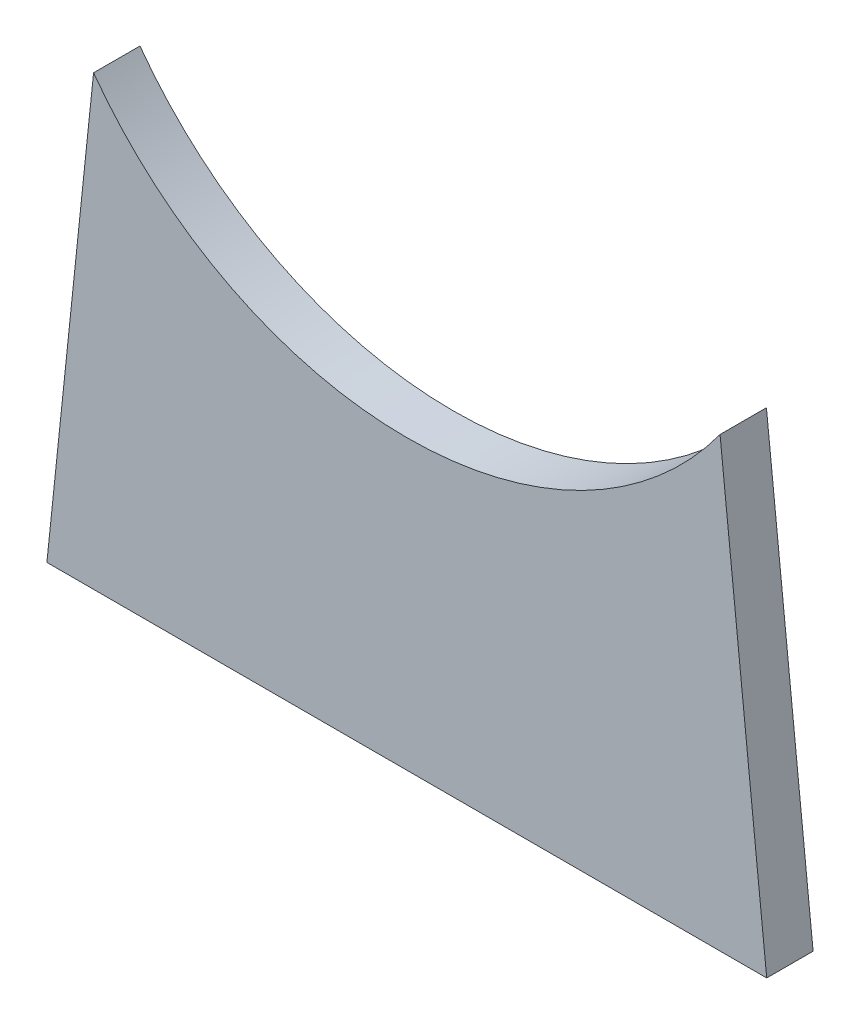
ISO-10303-21;
HEADER;
FILE_DESCRIPTION(('STEP AP214'),'2;1');
FILE_NAME('part.step','',(''),(''),'','','');
FILE_SCHEMA(('AUTOMOTIVE_DESIGN { 1 0 10303 214 1 1 1 1 }'));
ENDSEC;
DATA;
#1=APPLICATION_CONTEXT('core data for automotive mechanical design processes');
#2=APPLICATION_PROTOCOL_DEFINITION('international standard','automotive_design',2000,#1);
#3=PRODUCT_CONTEXT('',#1,'mechanical');
#4=PRODUCT('Part','Part','',(#3));
#5=PRODUCT_RELATED_PRODUCT_CATEGORY('part','',(#4));
#6=PRODUCT_DEFINITION_FORMATION('','',#4);
#7=PRODUCT_DEFINITION_CONTEXT('part definition',#1,'design');
#8=PRODUCT_DEFINITION('design','',#6,#7);
#9=PRODUCT_DEFINITION_SHAPE('','',#8);
#10=(LENGTH_UNIT() NAMED_UNIT(*) SI_UNIT(.MILLI.,.METRE.));
#11=(NAMED_UNIT(*) PLANE_ANGLE_UNIT() SI_UNIT($,.RADIAN.));
#12=(NAMED_UNIT(*) SI_UNIT($,.STERADIAN.) SOLID_ANGLE_UNIT());
#13=UNCERTAINTY_MEASURE_WITH_UNIT(LENGTH_MEASURE(1.E-05),#10,'distance_accuracy_value','');
#14=(GEOMETRIC_REPRESENTATION_CONTEXT(3) GLOBAL_UNCERTAINTY_ASSIGNED_CONTEXT((#13)) GLOBAL_UNIT_ASSIGNED_CONTEXT((#10,
#11,#12)) REPRESENTATION_CONTEXT('',''));
#15=CARTESIAN_POINT('',(0.,0.,0.));
#16=DIRECTION('',(0.,0.,1.));
#17=DIRECTION('',(1.,0.,0.));
#18=AXIS2_PLACEMENT_3D('',#15,#16,#17);
#19=CARTESIAN_POINT('',(-1978.125,0.,127.5));
#20=DIRECTION('',(0.994602548373375,-0.103758232295992,0.));
#21=DIRECTION('',(0.103758232295992,0.994602548373375,0.));
#22=AXIS2_PLACEMENT_3D('',#19,#20,#21);
#23=PLANE('',#22);
#24=DIRECTION('',(-0.103758232295992,-0.994602548373375,0.));
#25=VECTOR('',#24,1.);
#26=CARTESIAN_POINT('',(-1978.125,0.,-127.5));
#27=LINE('',#26,#25);
#28=CARTESIAN_POINT('',(-1721.625,2458.75,-127.5));
#29=VERTEX_POINT('',#28);
#30=CARTESIAN_POINT('',(-1978.125,0.,-127.5));
#31=VERTEX_POINT('',#30);
#32=EDGE_CURVE('E94',#29,#31,#27,.T.);
#33=ORIENTED_EDGE('',*,*,#32,.T.);
#34=DIRECTION('',(0.,0.,-1.));
#35=VECTOR('',#34,1.);
#36=CARTESIAN_POINT('',(-1978.125,0.,127.5));
#37=LINE('',#36,#35);
#38=CARTESIAN_POINT('',(-1978.125,0.,127.5));
#39=VERTEX_POINT('',#38);
#40=EDGE_CURVE('E11',#39,#31,#37,.T.);
#41=ORIENTED_EDGE('',*,*,#40,.F.);
#42=DIRECTION('',(-0.103758232295992,-0.994602548373375,0.));
#43=VECTOR('',#42,1.);
#44=CARTESIAN_POINT('',(-1978.125,0.,127.5));
#45=LINE('',#44,#43);
#46=CARTESIAN_POINT('',(-1721.625,2458.75,127.5));
#47=VERTEX_POINT('',#46);
#48=EDGE_CURVE('E82',#47,#39,#45,.T.);
#49=ORIENTED_EDGE('',*,*,#48,.F.);
#50=DIRECTION('',(0.,0.,-1.));
#51=VECTOR('',#50,1.);
#52=CARTESIAN_POINT('',(-1721.625,2458.75,127.5));
#53=LINE('',#52,#51);
#54=EDGE_CURVE('E90',#47,#29,#53,.T.);
#55=ORIENTED_EDGE('',*,*,#54,.T.);
#56=EDGE_LOOP('',(#33,#41,#49,#55));
#57=FACE_BOUND('',#56,.T.);
#58=ADVANCED_FACE('F31',(#57),#23,.F.);
#59=CARTESIAN_POINT('',(-1978.125,0.,127.5));
#60=DIRECTION('',(0.,1.,0.));
#61=DIRECTION('',(-1.,0.,0.));
#62=AXIS2_PLACEMENT_3D('',#59,#60,#61);
#63=PLANE('',#62);
#64=DIRECTION('',(1.,0.,0.));
#65=VECTOR('',#64,1.);
#66=CARTESIAN_POINT('',(-1978.125,0.,-127.5));
#67=LINE('',#66,#65);
#68=CARTESIAN_POINT('',(1978.125,4.84500889912672E-13,-127.5));
#69=VERTEX_POINT('',#68);
#70=EDGE_CURVE('E86',#31,#69,#67,.T.);
#71=ORIENTED_EDGE('',*,*,#70,.T.);
#72=DIRECTION('',(0.,0.,-1.));
#73=VECTOR('',#72,1.);
#74=CARTESIAN_POINT('',(1978.125,4.84500889912672E-13,127.5));
#75=LINE('',#74,#73);
#76=CARTESIAN_POINT('',(1978.125,4.84500889912672E-13,127.5));
#77=VERTEX_POINT('',#76);
#78=EDGE_CURVE('E39',#77,#69,#75,.T.);
#79=ORIENTED_EDGE('',*,*,#78,.F.);
#80=DIRECTION('',(1.,0.,0.));
#81=VECTOR('',#80,1.);
#82=CARTESIAN_POINT('',(-1978.125,0.,127.5));
#83=LINE('',#82,#81);
#84=EDGE_CURVE('E77',#39,#77,#83,.T.);
#85=ORIENTED_EDGE('',*,*,#84,.F.);
#86=ORIENTED_EDGE('',*,*,#40,.T.);
#87=EDGE_LOOP('',(#71,#79,#85,#86));
#88=FACE_BOUND('',#87,.T.);
#89=ADVANCED_FACE('F85',(#88),#63,.F.);
#90=CARTESIAN_POINT('',(1978.125,4.84500889912672E-13,127.5));
#91=DIRECTION('',(-0.994602548373375,-0.103758232295992,0.));
#92=DIRECTION('',(0.103758232295992,-0.994602548373375,0.));
#93=AXIS2_PLACEMENT_3D('',#90,#91,#92);
#94=PLANE('',#93);
#95=DIRECTION('',(-0.103758232295992,0.994602548373375,0.));
#96=VECTOR('',#95,1.);
#97=CARTESIAN_POINT('',(1978.125,4.84500889912672E-13,-127.5));
#98=LINE('',#97,#96);
#99=CARTESIAN_POINT('',(1721.625,2458.75,-127.5));
#100=VERTEX_POINT('',#99);
#101=EDGE_CURVE('E64',#69,#100,#98,.T.);
#102=ORIENTED_EDGE('',*,*,#101,.T.);
#103=DIRECTION('',(0.,0.,-1.));
#104=VECTOR('',#103,1.);
#105=CARTESIAN_POINT('',(1721.625,2458.75,127.5));
#106=LINE('',#105,#104);
#107=CARTESIAN_POINT('',(1721.625,2458.75,127.5));
#108=VERTEX_POINT('',#107);
#109=EDGE_CURVE('E87',#108,#100,#106,.T.);
#110=ORIENTED_EDGE('',*,*,#109,.F.);
#111=DIRECTION('',(-0.103758232295992,0.994602548373375,0.));
#112=VECTOR('',#111,1.);
#113=CARTESIAN_POINT('',(1978.125,4.84500889912672E-13,127.5));
#114=LINE('',#113,#112);
#115=EDGE_CURVE('E80',#77,#108,#114,.T.);
#116=ORIENTED_EDGE('',*,*,#115,.F.);
#117=ORIENTED_EDGE('',*,*,#78,.T.);
#118=EDGE_LOOP('',(#102,#110,#116,#117));
#119=FACE_BOUND('',#118,.T.);
#120=ADVANCED_FACE('F88',(#119),#94,.F.);
#121=CARTESIAN_POINT('',(-2.22044604925031E-13,3712.94594558715,127.5));
#122=DIRECTION('',(0.,0.,-1.));
#123=DIRECTION('',(-1.,0.,0.));
#124=AXIS2_PLACEMENT_3D('',#121,#122,#123);
#125=CYLINDRICAL_SURFACE('',#124,2130.0235);
#126=CARTESIAN_POINT('',(-2.22044604925031E-13,3712.94594558715,-127.5));
#127=DIRECTION('',(0.,0.,-1.));
#128=DIRECTION('',(1.,0.,0.));
#129=AXIS2_PLACEMENT_3D('',#126,#127,#128);
#130=CIRCLE('',#129,2130.0235);
#131=EDGE_CURVE('E70',#100,#29,#130,.T.);
#132=ORIENTED_EDGE('',*,*,#131,.T.);
#133=ORIENTED_EDGE('',*,*,#54,.F.);
#134=CARTESIAN_POINT('',(-2.22044604925031E-13,3712.94594558715,127.5));
#135=DIRECTION('',(0.,0.,-1.));
#136=DIRECTION('',(1.,0.,0.));
#137=AXIS2_PLACEMENT_3D('',#134,#135,#136);
#138=CIRCLE('',#137,2130.0235);
#139=EDGE_CURVE('E47',#108,#47,#138,.T.);
#140=ORIENTED_EDGE('',*,*,#139,.F.);
#141=ORIENTED_EDGE('',*,*,#109,.T.);
#142=EDGE_LOOP('',(#132,#133,#140,#141));
#143=FACE_BOUND('',#142,.T.);
#144=ADVANCED_FACE('F101',(#143),#125,.F.);
#145=CARTESIAN_POINT('',(-2.22044604925031E-13,3712.94594558715,127.5));
#146=DIRECTION('',(0.,0.,1.));
#147=DIRECTION('',(1.,0.,0.));
#148=AXIS2_PLACEMENT_3D('',#145,#146,#147);
#149=PLANE('',#148);
#150=ORIENTED_EDGE('',*,*,#48,.T.);
#151=ORIENTED_EDGE('',*,*,#84,.T.);
#152=ORIENTED_EDGE('',*,*,#115,.T.);
#153=ORIENTED_EDGE('',*,*,#139,.T.);
#154=EDGE_LOOP('',(#150,#151,#152,#153));
#155=FACE_BOUND('',#154,.T.);
#156=ADVANCED_FACE('F78',(#155),#149,.T.);
#157=CARTESIAN_POINT('',(-2.22044604925031E-13,3712.94594558715,-127.5));
#158=DIRECTION('',(0.,0.,1.));
#159=DIRECTION('',(1.,0.,0.));
#160=AXIS2_PLACEMENT_3D('',#157,#158,#159);
#161=PLANE('',#160);
#162=ORIENTED_EDGE('',*,*,#32,.F.);
#163=ORIENTED_EDGE('',*,*,#131,.F.);
#164=ORIENTED_EDGE('',*,*,#101,.F.);
#165=ORIENTED_EDGE('',*,*,#70,.F.);
#166=EDGE_LOOP('',(#162,#163,#164,#165));
#167=FACE_BOUND('',#166,.T.);
#168=ADVANCED_FACE('F104',(#167),#161,.F.);
#169=CLOSED_SHELL('',(#58,#89,#120,#144,#156,#168));
#170=MANIFOLD_SOLID_BREP('B2',#169);
#171=ADVANCED_BREP_SHAPE_REPRESENTATION('',(#18,#170),#14);
#172=SHAPE_DEFINITION_REPRESENTATION(#9,#171);
ENDSEC;
END-ISO-10303-21;
